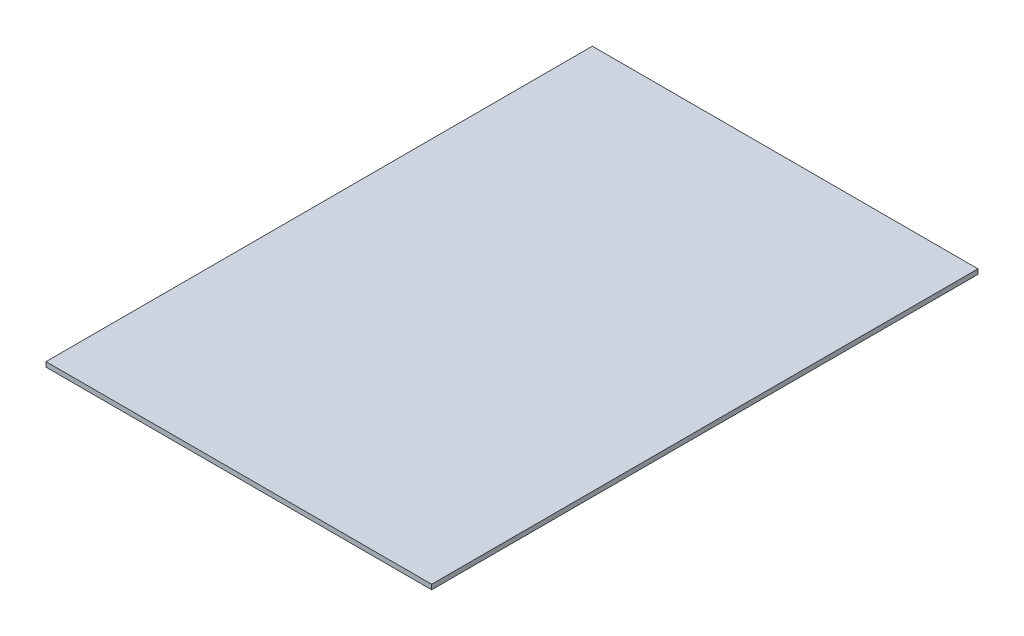
ISO-10303-21;
HEADER;
FILE_DESCRIPTION(('STEP AP214'),'2;1');
FILE_NAME('part.step','',(''),(''),'','','');
FILE_SCHEMA(('AUTOMOTIVE_DESIGN { 1 0 10303 214 1 1 1 1 }'));
ENDSEC;
DATA;
#1=APPLICATION_CONTEXT('core data for automotive mechanical design processes');
#2=APPLICATION_PROTOCOL_DEFINITION('international standard','automotive_design',2000,#1);
#3=PRODUCT_CONTEXT('',#1,'mechanical');
#4=PRODUCT('Part','Part','',(#3));
#5=PRODUCT_RELATED_PRODUCT_CATEGORY('part','',(#4));
#6=PRODUCT_DEFINITION_FORMATION('','',#4);
#7=PRODUCT_DEFINITION_CONTEXT('part definition',#1,'design');
#8=PRODUCT_DEFINITION('design','',#6,#7);
#9=PRODUCT_DEFINITION_SHAPE('','',#8);
#10=(LENGTH_UNIT() NAMED_UNIT(*) SI_UNIT(.MILLI.,.METRE.));
#11=(NAMED_UNIT(*) PLANE_ANGLE_UNIT() SI_UNIT($,.RADIAN.));
#12=(NAMED_UNIT(*) SI_UNIT($,.STERADIAN.) SOLID_ANGLE_UNIT());
#13=UNCERTAINTY_MEASURE_WITH_UNIT(LENGTH_MEASURE(1.E-05),#10,'distance_accuracy_value','');
#14=(GEOMETRIC_REPRESENTATION_CONTEXT(3) GLOBAL_UNCERTAINTY_ASSIGNED_CONTEXT((#13)) GLOBAL_UNIT_ASSIGNED_CONTEXT((#10,
#11,#12)) REPRESENTATION_CONTEXT('',''));
#15=CARTESIAN_POINT('',(0.,0.,0.));
#16=DIRECTION('',(0.,0.,1.));
#17=DIRECTION('',(1.,0.,0.));
#18=AXIS2_PLACEMENT_3D('',#15,#16,#17);
#19=CARTESIAN_POINT('',(152.4,1.905,-215.9));
#20=DIRECTION('',(-1.,0.,0.));
#21=DIRECTION('',(0.,0.,1.));
#22=AXIS2_PLACEMENT_3D('',#19,#20,#21);
#23=PLANE('',#22);
#24=DIRECTION('',(0.,0.,-1.));
#25=VECTOR('',#24,1.);
#26=CARTESIAN_POINT('',(152.4,0.,-215.9));
#27=LINE('',#26,#25);
#28=CARTESIAN_POINT('',(152.4,0.,0.));
#29=VERTEX_POINT('',#28);
#30=CARTESIAN_POINT('',(152.4,0.,-215.9));
#31=VERTEX_POINT('',#30);
#32=EDGE_CURVE('E110',#29,#31,#27,.T.);
#33=ORIENTED_EDGE('',*,*,#32,.T.);
#34=DIRECTION('',(0.,-1.,0.));
#35=VECTOR('',#34,1.);
#36=CARTESIAN_POINT('',(152.4,1.905,-215.9));
#37=LINE('',#36,#35);
#38=CARTESIAN_POINT('',(152.4,1.905,-215.9));
#39=VERTEX_POINT('',#38);
#40=EDGE_CURVE('E11',#39,#31,#37,.T.);
#41=ORIENTED_EDGE('',*,*,#40,.F.);
#42=DIRECTION('',(0.,0.,-1.));
#43=VECTOR('',#42,1.);
#44=CARTESIAN_POINT('',(152.4,1.905,-215.9));
#45=LINE('',#44,#43);
#46=CARTESIAN_POINT('',(152.4,1.905,0.));
#47=VERTEX_POINT('',#46);
#48=EDGE_CURVE('E94',#47,#39,#45,.T.);
#49=ORIENTED_EDGE('',*,*,#48,.F.);
#50=DIRECTION('',(0.,-1.,0.));
#51=VECTOR('',#50,1.);
#52=CARTESIAN_POINT('',(152.4,1.905,0.));
#53=LINE('',#52,#51);
#54=EDGE_CURVE('E106',#47,#29,#53,.T.);
#55=ORIENTED_EDGE('',*,*,#54,.T.);
#56=EDGE_LOOP('',(#33,#41,#49,#55));
#57=FACE_BOUND('',#56,.T.);
#58=ADVANCED_FACE('F42',(#57),#23,.F.);
#59=CARTESIAN_POINT('',(152.4,1.905,-215.9));
#60=DIRECTION('',(0.,0.,1.));
#61=DIRECTION('',(1.,0.,0.));
#62=AXIS2_PLACEMENT_3D('',#59,#60,#61);
#63=PLANE('',#62);
#64=DIRECTION('',(-1.,0.,0.));
#65=VECTOR('',#64,1.);
#66=CARTESIAN_POINT('',(152.4,0.,-215.9));
#67=LINE('',#66,#65);
#68=CARTESIAN_POINT('',(0.,0.,-215.9));
#69=VERTEX_POINT('',#68);
#70=EDGE_CURVE('E99',#31,#69,#67,.T.);
#71=ORIENTED_EDGE('',*,*,#70,.T.);
#72=DIRECTION('',(0.,-1.,0.));
#73=VECTOR('',#72,1.);
#74=CARTESIAN_POINT('',(0.,1.905,-215.9));
#75=LINE('',#74,#73);
#76=CARTESIAN_POINT('',(0.,1.905,-215.9));
#77=VERTEX_POINT('',#76);
#78=EDGE_CURVE('E51',#77,#69,#75,.T.);
#79=ORIENTED_EDGE('',*,*,#78,.F.);
#80=DIRECTION('',(-1.,0.,0.));
#81=VECTOR('',#80,1.);
#82=CARTESIAN_POINT('',(152.4,1.905,-215.9));
#83=LINE('',#82,#81);
#84=EDGE_CURVE('E89',#39,#77,#83,.T.);
#85=ORIENTED_EDGE('',*,*,#84,.F.);
#86=ORIENTED_EDGE('',*,*,#40,.T.);
#87=EDGE_LOOP('',(#71,#79,#85,#86));
#88=FACE_BOUND('',#87,.T.);
#89=ADVANCED_FACE('F98',(#88),#63,.F.);
#90=CARTESIAN_POINT('',(0.,1.905,-215.9));
#91=DIRECTION('',(1.,0.,0.));
#92=DIRECTION('',(0.,0.,-1.));
#93=AXIS2_PLACEMENT_3D('',#90,#91,#92);
#94=PLANE('',#93);
#95=DIRECTION('',(0.,0.,1.));
#96=VECTOR('',#95,1.);
#97=CARTESIAN_POINT('',(0.,0.,-215.9));
#98=LINE('',#97,#96);
#99=CARTESIAN_POINT('',(0.,0.,0.));
#100=VERTEX_POINT('',#99);
#101=EDGE_CURVE('E76',#69,#100,#98,.T.);
#102=ORIENTED_EDGE('',*,*,#101,.T.);
#103=DIRECTION('',(0.,-1.,0.));
#104=VECTOR('',#103,1.);
#105=CARTESIAN_POINT('',(0.,1.905,0.));
#106=LINE('',#105,#104);
#107=CARTESIAN_POINT('',(0.,1.905,0.));
#108=VERTEX_POINT('',#107);
#109=EDGE_CURVE('E101',#108,#100,#106,.T.);
#110=ORIENTED_EDGE('',*,*,#109,.F.);
#111=DIRECTION('',(0.,0.,1.));
#112=VECTOR('',#111,1.);
#113=CARTESIAN_POINT('',(0.,1.905,-215.9));
#114=LINE('',#113,#112);
#115=EDGE_CURVE('E92',#77,#108,#114,.T.);
#116=ORIENTED_EDGE('',*,*,#115,.F.);
#117=ORIENTED_EDGE('',*,*,#78,.T.);
#118=EDGE_LOOP('',(#102,#110,#116,#117));
#119=FACE_BOUND('',#118,.T.);
#120=ADVANCED_FACE('F102',(#119),#94,.F.);
#121=CARTESIAN_POINT('',(152.4,1.905,0.));
#122=DIRECTION('',(0.,0.,-1.));
#123=DIRECTION('',(-1.,0.,0.));
#124=AXIS2_PLACEMENT_3D('',#121,#122,#123);
#125=PLANE('',#124);
#126=DIRECTION('',(1.,0.,0.));
#127=VECTOR('',#126,1.);
#128=CARTESIAN_POINT('',(152.4,0.,0.));
#129=LINE('',#128,#127);
#130=EDGE_CURVE('E82',#100,#29,#129,.T.);
#131=ORIENTED_EDGE('',*,*,#130,.T.);
#132=ORIENTED_EDGE('',*,*,#54,.F.);
#133=DIRECTION('',(1.,0.,0.));
#134=VECTOR('',#133,1.);
#135=CARTESIAN_POINT('',(152.4,1.905,0.));
#136=LINE('',#135,#134);
#137=EDGE_CURVE('E59',#108,#47,#136,.T.);
#138=ORIENTED_EDGE('',*,*,#137,.F.);
#139=ORIENTED_EDGE('',*,*,#109,.T.);
#140=EDGE_LOOP('',(#131,#132,#138,#139));
#141=FACE_BOUND('',#140,.T.);
#142=ADVANCED_FACE('F123',(#141),#125,.F.);
#143=CARTESIAN_POINT('',(0.,1.905,0.));
#144=DIRECTION('',(0.,-1.,0.));
#145=DIRECTION('',(0.,0.,-1.));
#146=AXIS2_PLACEMENT_3D('',#143,#144,#145);
#147=PLANE('',#146);
#148=ORIENTED_EDGE('',*,*,#48,.T.);
#149=ORIENTED_EDGE('',*,*,#84,.T.);
#150=ORIENTED_EDGE('',*,*,#115,.T.);
#151=ORIENTED_EDGE('',*,*,#137,.T.);
#152=EDGE_LOOP('',(#148,#149,#150,#151));
#153=FACE_BOUND('',#152,.T.);
#154=ADVANCED_FACE('F90',(#153),#147,.F.);
#155=CARTESIAN_POINT('',(0.,0.,0.));
#156=DIRECTION('',(0.,-1.,0.));
#157=DIRECTION('',(0.,0.,-1.));
#158=AXIS2_PLACEMENT_3D('',#155,#156,#157);
#159=PLANE('',#158);
#160=ORIENTED_EDGE('',*,*,#32,.F.);
#161=ORIENTED_EDGE('',*,*,#130,.F.);
#162=ORIENTED_EDGE('',*,*,#101,.F.);
#163=ORIENTED_EDGE('',*,*,#70,.F.);
#164=EDGE_LOOP('',(#160,#161,#162,#163));
#165=FACE_BOUND('',#164,.T.);
#166=ADVANCED_FACE('F126',(#165),#159,.T.);
#167=CLOSED_SHELL('',(#58,#89,#120,#142,#154,#166));
#168=MANIFOLD_SOLID_BREP('B2',#167);
#169=ADVANCED_BREP_SHAPE_REPRESENTATION('',(#18,#168),#14);
#170=SHAPE_DEFINITION_REPRESENTATION(#9,#169);
ENDSEC;
END-ISO-10303-21;
